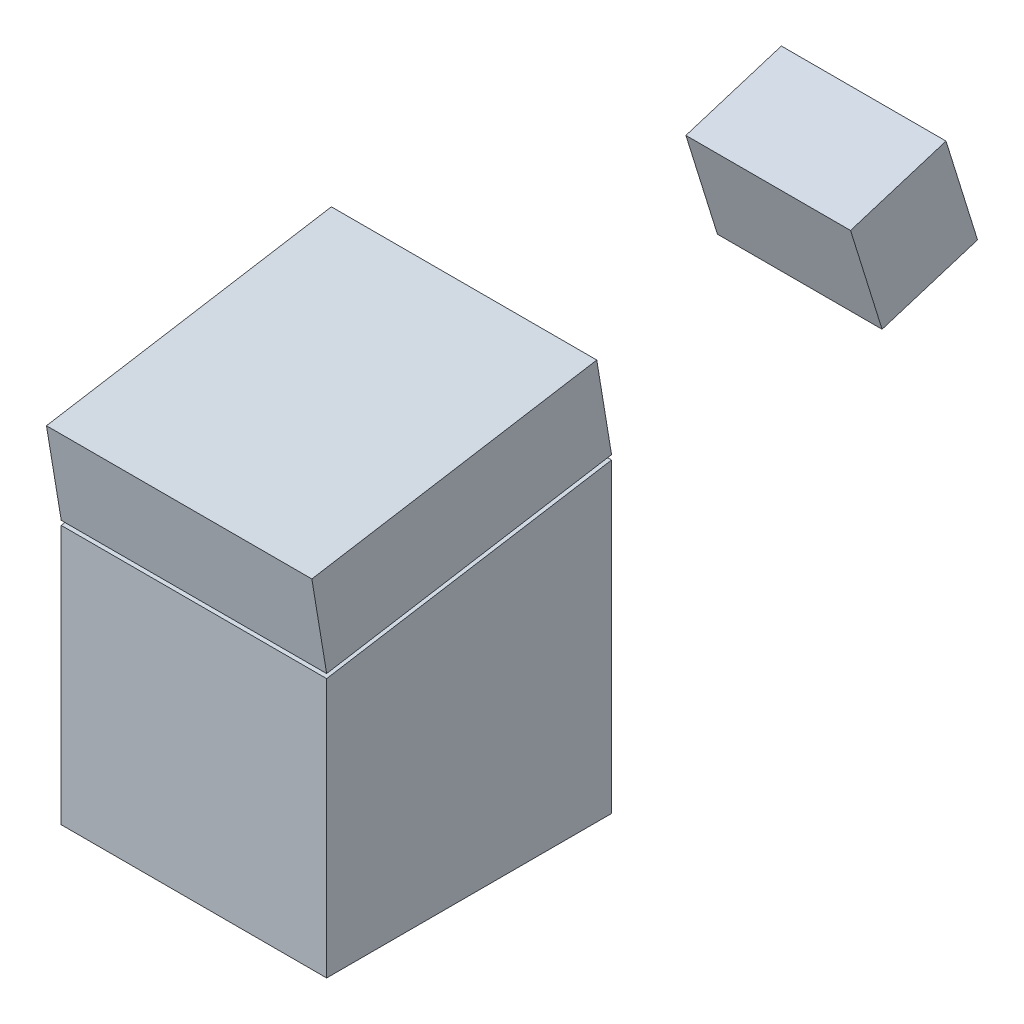
ISO-10303-21;
HEADER;
FILE_DESCRIPTION(('STEP AP214'),'2;1');
FILE_NAME('part.step','',(''),(''),'','','');
FILE_SCHEMA(('AUTOMOTIVE_DESIGN { 1 0 10303 214 1 1 1 1 }'));
ENDSEC;
DATA;
#1=APPLICATION_CONTEXT('core data for automotive mechanical design processes');
#2=APPLICATION_PROTOCOL_DEFINITION('international standard','automotive_design',2000,#1);
#3=PRODUCT_CONTEXT('',#1,'mechanical');
#4=PRODUCT('Part','Part','',(#3));
#5=PRODUCT_RELATED_PRODUCT_CATEGORY('part','',(#4));
#6=PRODUCT_DEFINITION_FORMATION('','',#4);
#7=PRODUCT_DEFINITION_CONTEXT('part definition',#1,'design');
#8=PRODUCT_DEFINITION('design','',#6,#7);
#9=PRODUCT_DEFINITION_SHAPE('','',#8);
#10=(LENGTH_UNIT() NAMED_UNIT(*) SI_UNIT(.MILLI.,.METRE.));
#11=(NAMED_UNIT(*) PLANE_ANGLE_UNIT() SI_UNIT($,.RADIAN.));
#12=(NAMED_UNIT(*) SI_UNIT($,.STERADIAN.) SOLID_ANGLE_UNIT());
#13=UNCERTAINTY_MEASURE_WITH_UNIT(LENGTH_MEASURE(1.E-05),#10,'distance_accuracy_value','');
#14=(GEOMETRIC_REPRESENTATION_CONTEXT(3) GLOBAL_UNCERTAINTY_ASSIGNED_CONTEXT((#13)) GLOBAL_UNIT_ASSIGNED_CONTEXT((#10,
#11,#12)) REPRESENTATION_CONTEXT('',''));
#15=CARTESIAN_POINT('',(0.,0.,0.));
#16=DIRECTION('',(0.,0.,1.));
#17=DIRECTION('',(1.,0.,0.));
#18=AXIS2_PLACEMENT_3D('',#15,#16,#17);
#19=CARTESIAN_POINT('',(-99.4303565591252,496.325864835687,685.54268727269));
#20=DIRECTION('',(0.,-0.297108830471233,0.9548436222));
#21=DIRECTION('',(0.,-0.9548436222,-0.297108830471233));
#22=AXIS2_PLACEMENT_3D('',#19,#20,#21);
#23=PLANE('',#22);
#24=DIRECTION('',(0.,-0.9548436222,-0.297108830471233));
#25=VECTOR('',#24,1.);
#26=CARTESIAN_POINT('',(99.4303565591252,496.325864835687,685.54268727269));
#27=LINE('',#26,#25);
#28=CARTESIAN_POINT('',(99.4303565591252,496.325864835687,685.54268727269));
#29=VERTEX_POINT('',#28);
#30=CARTESIAN_POINT('',(99.4303565591252,373.924864574069,647.456431899848));
#31=VERTEX_POINT('',#30);
#32=EDGE_CURVE('E114',#29,#31,#27,.T.);
#33=ORIENTED_EDGE('',*,*,#32,.F.);
#34=DIRECTION('',(1.,0.,0.));
#35=VECTOR('',#34,1.);
#36=CARTESIAN_POINT('',(-99.4303565591252,496.325864835687,685.54268727269));
#37=LINE('',#36,#35);
#38=CARTESIAN_POINT('',(-99.4303565591252,496.325864835687,685.54268727269));
#39=VERTEX_POINT('',#38);
#40=EDGE_CURVE('E12',#39,#29,#37,.T.);
#41=ORIENTED_EDGE('',*,*,#40,.F.);
#42=DIRECTION('',(0.,-0.9548436222,-0.297108830471233));
#43=VECTOR('',#42,1.);
#44=CARTESIAN_POINT('',(-99.4303565591252,496.325864835687,685.54268727269));
#45=LINE('',#44,#43);
#46=CARTESIAN_POINT('',(-99.4303565591252,373.924864574069,647.456431899848));
#47=VERTEX_POINT('',#46);
#48=EDGE_CURVE('E108',#39,#47,#45,.T.);
#49=ORIENTED_EDGE('',*,*,#48,.T.);
#50=DIRECTION('',(1.,0.,0.));
#51=VECTOR('',#50,1.);
#52=CARTESIAN_POINT('',(-99.4303565591252,373.924864574069,647.456431899848));
#53=LINE('',#52,#51);
#54=EDGE_CURVE('E53',#47,#31,#53,.T.);
#55=ORIENTED_EDGE('',*,*,#54,.T.);
#56=EDGE_LOOP('',(#33,#41,#49,#55));
#57=FACE_BOUND('',#56,.T.);
#58=ADVANCED_FACE('F50',(#57),#23,.T.);
#59=CARTESIAN_POINT('',(-99.4303565591252,532.198007420288,570.257367387619));
#60=DIRECTION('',(0.,0.9548436222,0.297108830471234));
#61=DIRECTION('',(0.,-0.297108830471234,0.9548436222));
#62=AXIS2_PLACEMENT_3D('',#59,#60,#61);
#63=PLANE('',#62);
#64=DIRECTION('',(0.,-0.297108830471234,0.9548436222));
#65=VECTOR('',#64,1.);
#66=CARTESIAN_POINT('',(99.4303565591252,532.198007420288,570.257367387619));
#67=LINE('',#66,#65);
#68=CARTESIAN_POINT('',(99.4303565591252,532.198007420288,570.257367387619));
#69=VERTEX_POINT('',#68);
#70=EDGE_CURVE('E110',#69,#29,#67,.T.);
#71=ORIENTED_EDGE('',*,*,#70,.F.);
#72=DIRECTION('',(1.,0.,0.));
#73=VECTOR('',#72,1.);
#74=CARTESIAN_POINT('',(-99.4303565591252,532.198007420288,570.257367387619));
#75=LINE('',#74,#73);
#76=CARTESIAN_POINT('',(-99.4303565591252,532.198007420288,570.257367387619));
#77=VERTEX_POINT('',#76);
#78=EDGE_CURVE('E59',#77,#69,#75,.T.);
#79=ORIENTED_EDGE('',*,*,#78,.F.);
#80=DIRECTION('',(0.,-0.297108830471234,0.9548436222));
#81=VECTOR('',#80,1.);
#82=CARTESIAN_POINT('',(-99.4303565591252,532.198007420288,570.257367387619));
#83=LINE('',#82,#81);
#84=EDGE_CURVE('E105',#77,#39,#83,.T.);
#85=ORIENTED_EDGE('',*,*,#84,.T.);
#86=ORIENTED_EDGE('',*,*,#40,.T.);
#87=EDGE_LOOP('',(#71,#79,#85,#86));
#88=FACE_BOUND('',#87,.T.);
#89=ADVANCED_FACE('F124',(#88),#63,.T.);
#90=CARTESIAN_POINT('',(-99.4303565591252,409.79700715867,532.171112014777));
#91=DIRECTION('',(0.,0.297108830471235,-0.954843622199999));
#92=DIRECTION('',(0.,0.954843622199999,0.297108830471235));
#93=AXIS2_PLACEMENT_3D('',#90,#91,#92);
#94=PLANE('',#93);
#95=DIRECTION('',(0.,0.954843622199999,0.297108830471235));
#96=VECTOR('',#95,1.);
#97=CARTESIAN_POINT('',(99.4303565591252,409.79700715867,532.171112014777));
#98=LINE('',#97,#96);
#99=CARTESIAN_POINT('',(99.4303565591252,409.79700715867,532.171112014777));
#100=VERTEX_POINT('',#99);
#101=EDGE_CURVE('E100',#100,#69,#98,.T.);
#102=ORIENTED_EDGE('',*,*,#101,.F.);
#103=DIRECTION('',(1.,0.,0.));
#104=VECTOR('',#103,1.);
#105=CARTESIAN_POINT('',(-99.4303565591252,409.79700715867,532.171112014777));
#106=LINE('',#105,#104);
#107=CARTESIAN_POINT('',(-99.4303565591252,409.79700715867,532.171112014777));
#108=VERTEX_POINT('',#107);
#109=EDGE_CURVE('E95',#108,#100,#106,.T.);
#110=ORIENTED_EDGE('',*,*,#109,.F.);
#111=DIRECTION('',(0.,0.954843622199999,0.297108830471235));
#112=VECTOR('',#111,1.);
#113=CARTESIAN_POINT('',(-99.4303565591252,409.79700715867,532.171112014777));
#114=LINE('',#113,#112);
#115=EDGE_CURVE('E98',#108,#77,#114,.T.);
#116=ORIENTED_EDGE('',*,*,#115,.T.);
#117=ORIENTED_EDGE('',*,*,#78,.T.);
#118=EDGE_LOOP('',(#102,#110,#116,#117));
#119=FACE_BOUND('',#118,.T.);
#120=ADVANCED_FACE('F97',(#119),#94,.T.);
#121=CARTESIAN_POINT('',(-99.4303565591252,373.924864574069,647.456431899848));
#122=DIRECTION('',(0.,-0.9548436222,-0.297108830471233));
#123=DIRECTION('',(0.,0.297108830471233,-0.9548436222));
#124=AXIS2_PLACEMENT_3D('',#121,#122,#123);
#125=PLANE('',#124);
#126=DIRECTION('',(0.,0.297108830471233,-0.9548436222));
#127=VECTOR('',#126,1.);
#128=CARTESIAN_POINT('',(99.4303565591252,373.924864574069,647.456431899848));
#129=LINE('',#128,#127);
#130=EDGE_CURVE('E117',#31,#100,#129,.T.);
#131=ORIENTED_EDGE('',*,*,#130,.F.);
#132=ORIENTED_EDGE('',*,*,#54,.F.);
#133=DIRECTION('',(0.,0.297108830471233,-0.9548436222));
#134=VECTOR('',#133,1.);
#135=CARTESIAN_POINT('',(-99.4303565591252,373.924864574069,647.456431899848));
#136=LINE('',#135,#134);
#137=EDGE_CURVE('E104',#47,#108,#136,.T.);
#138=ORIENTED_EDGE('',*,*,#137,.T.);
#139=ORIENTED_EDGE('',*,*,#109,.T.);
#140=EDGE_LOOP('',(#131,#132,#138,#139));
#141=FACE_BOUND('',#140,.T.);
#142=ADVANCED_FACE('F107',(#141),#125,.T.);
#143=CARTESIAN_POINT('',(-99.4303565591252,0.,0.));
#144=DIRECTION('',(1.,0.,0.));
#145=DIRECTION('',(0.,0.,-1.));
#146=AXIS2_PLACEMENT_3D('',#143,#144,#145);
#147=PLANE('',#146);
#148=ORIENTED_EDGE('',*,*,#48,.F.);
#149=ORIENTED_EDGE('',*,*,#84,.F.);
#150=ORIENTED_EDGE('',*,*,#115,.F.);
#151=ORIENTED_EDGE('',*,*,#137,.F.);
#152=EDGE_LOOP('',(#148,#149,#150,#151));
#153=FACE_BOUND('',#152,.T.);
#154=ADVANCED_FACE('F103',(#153),#147,.F.);
#155=CARTESIAN_POINT('',(99.4303565591252,0.,0.));
#156=DIRECTION('',(1.,0.,0.));
#157=DIRECTION('',(0.,0.,-1.));
#158=AXIS2_PLACEMENT_3D('',#155,#156,#157);
#159=PLANE('',#158);
#160=ORIENTED_EDGE('',*,*,#32,.T.);
#161=ORIENTED_EDGE('',*,*,#130,.T.);
#162=ORIENTED_EDGE('',*,*,#101,.T.);
#163=ORIENTED_EDGE('',*,*,#70,.T.);
#164=EDGE_LOOP('',(#160,#161,#162,#163));
#165=FACE_BOUND('',#164,.T.);
#166=ADVANCED_FACE('F123',(#165),#159,.T.);
#167=CLOSED_SHELL('',(#58,#89,#120,#142,#154,#166));
#168=MANIFOLD_SOLID_BREP('B2',#167);
#169=CARTESIAN_POINT('',(160.270085725645,517.980453358781,1397.00864886196));
#170=DIRECTION('',(0.,0.163226948434065,-0.986588548131846));
#171=DIRECTION('',(0.,0.986588548131846,0.163226948434065));
#172=AXIS2_PLACEMENT_3D('',#169,#170,#171);
#173=PLANE('',#172);
#174=DIRECTION('',(0.,-0.986588548131846,-0.163226948434065));
#175=VECTOR('',#174,1.);
#176=CARTESIAN_POINT('',(-160.270085725645,517.980453358781,1397.00864886196));
#177=LINE('',#176,#175);
#178=CARTESIAN_POINT('',(-160.270085725645,517.980453358781,1397.00864886196));
#179=VERTEX_POINT('',#178);
#180=CARTESIAN_POINT('',(-160.270085725645,410.056373940299,1379.15306136362));
#181=VERTEX_POINT('',#180);
#182=EDGE_CURVE('E246',#179,#181,#177,.T.);
#183=ORIENTED_EDGE('',*,*,#182,.T.);
#184=DIRECTION('',(-1.,0.,0.));
#185=VECTOR('',#184,1.);
#186=CARTESIAN_POINT('',(160.270085725645,410.056373940299,1379.15306136362));
#187=LINE('',#186,#185);
#188=CARTESIAN_POINT('',(160.270085725645,410.056373940299,1379.15306136362));
#189=VERTEX_POINT('',#188);
#190=EDGE_CURVE('E48',#189,#181,#187,.T.);
#191=ORIENTED_EDGE('',*,*,#190,.F.);
#192=DIRECTION('',(0.,-0.986588548131846,-0.163226948434065));
#193=VECTOR('',#192,1.);
#194=CARTESIAN_POINT('',(160.270085725645,517.980453358781,1397.00864886196));
#195=LINE('',#194,#193);
#196=CARTESIAN_POINT('',(160.270085725645,517.980453358781,1397.00864886196));
#197=VERTEX_POINT('',#196);
#198=EDGE_CURVE('E234',#197,#189,#195,.T.);
#199=ORIENTED_EDGE('',*,*,#198,.F.);
#200=DIRECTION('',(-1.,0.,0.));
#201=VECTOR('',#200,1.);
#202=CARTESIAN_POINT('',(160.270085725645,517.980453358781,1397.00864886196));
#203=LINE('',#202,#201);
#204=EDGE_CURVE('E242',#197,#179,#203,.T.);
#205=ORIENTED_EDGE('',*,*,#204,.T.);
#206=EDGE_LOOP('',(#183,#191,#199,#205));
#207=FACE_BOUND('',#206,.T.);
#208=ADVANCED_FACE('F183',(#207),#173,.F.);
#209=CARTESIAN_POINT('',(160.270085725645,410.056373940299,1379.15306136362));
#210=DIRECTION('',(0.,0.986588548131846,0.163226948434065));
#211=DIRECTION('',(0.,-0.163226948434065,0.986588548131845));
#212=AXIS2_PLACEMENT_3D('',#209,#210,#211);
#213=PLANE('',#212);
#214=DIRECTION('',(0.,0.163226948434065,-0.986588548131846));
#215=VECTOR('',#214,1.);
#216=CARTESIAN_POINT('',(-160.270085725645,410.056373940299,1379.15306136362));
#217=LINE('',#216,#215);
#218=CARTESIAN_POINT('',(-160.270085725645,466.987725211271,1035.04432360638));
#219=VERTEX_POINT('',#218);
#220=EDGE_CURVE('E238',#181,#219,#217,.T.);
#221=ORIENTED_EDGE('',*,*,#220,.T.);
#222=DIRECTION('',(-1.,0.,0.));
#223=VECTOR('',#222,1.);
#224=CARTESIAN_POINT('',(160.270085725645,466.987725211271,1035.04432360638));
#225=LINE('',#224,#223);
#226=CARTESIAN_POINT('',(160.270085725645,466.987725211271,1035.04432360638));
#227=VERTEX_POINT('',#226);
#228=EDGE_CURVE('E191',#227,#219,#225,.T.);
#229=ORIENTED_EDGE('',*,*,#228,.F.);
#230=DIRECTION('',(0.,0.163226948434065,-0.986588548131846));
#231=VECTOR('',#230,1.);
#232=CARTESIAN_POINT('',(160.270085725645,410.056373940299,1379.15306136362));
#233=LINE('',#232,#231);
#234=EDGE_CURVE('E229',#189,#227,#233,.T.);
#235=ORIENTED_EDGE('',*,*,#234,.F.);
#236=ORIENTED_EDGE('',*,*,#190,.T.);
#237=EDGE_LOOP('',(#221,#229,#235,#236));
#238=FACE_BOUND('',#237,.T.);
#239=ADVANCED_FACE('F237',(#238),#213,.F.);
#240=CARTESIAN_POINT('',(160.270085725645,466.987725211271,1035.04432360638));
#241=DIRECTION('',(0.,-0.163226948434065,0.986588548131846));
#242=DIRECTION('',(0.,-0.986588548131846,-0.163226948434065));
#243=AXIS2_PLACEMENT_3D('',#240,#241,#242);
#244=PLANE('',#243);
#245=DIRECTION('',(0.,0.986588548131845,0.163226948434065));
#246=VECTOR('',#245,1.);
#247=CARTESIAN_POINT('',(-160.270085725645,466.987725211271,1035.04432360638));
#248=LINE('',#247,#246);
#249=CARTESIAN_POINT('',(-160.270085725645,574.911804629753,1052.89991110472));
#250=VERTEX_POINT('',#249);
#251=EDGE_CURVE('E216',#219,#250,#248,.T.);
#252=ORIENTED_EDGE('',*,*,#251,.T.);
#253=DIRECTION('',(-1.,0.,0.));
#254=VECTOR('',#253,1.);
#255=CARTESIAN_POINT('',(160.270085725645,574.911804629753,1052.89991110472));
#256=LINE('',#255,#254);
#257=CARTESIAN_POINT('',(160.270085725645,574.911804629753,1052.89991110472));
#258=VERTEX_POINT('',#257);
#259=EDGE_CURVE('E239',#258,#250,#256,.T.);
#260=ORIENTED_EDGE('',*,*,#259,.F.);
#261=DIRECTION('',(0.,0.986588548131845,0.163226948434065));
#262=VECTOR('',#261,1.);
#263=CARTESIAN_POINT('',(160.270085725645,466.987725211271,1035.04432360638));
#264=LINE('',#263,#262);
#265=EDGE_CURVE('E232',#227,#258,#264,.T.);
#266=ORIENTED_EDGE('',*,*,#265,.F.);
#267=ORIENTED_EDGE('',*,*,#228,.T.);
#268=EDGE_LOOP('',(#252,#260,#266,#267));
#269=FACE_BOUND('',#268,.T.);
#270=ADVANCED_FACE('F240',(#269),#244,.F.);
#271=CARTESIAN_POINT('',(160.270085725645,574.911804629753,1052.89991110472));
#272=DIRECTION('',(0.,-0.986588548131846,-0.163226948434065));
#273=DIRECTION('',(0.,0.163226948434065,-0.986588548131846));
#274=AXIS2_PLACEMENT_3D('',#271,#272,#273);
#275=PLANE('',#274);
#276=DIRECTION('',(0.,-0.163226948434065,0.986588548131846));
#277=VECTOR('',#276,1.);
#278=CARTESIAN_POINT('',(-160.270085725645,574.911804629753,1052.89991110472));
#279=LINE('',#278,#277);
#280=EDGE_CURVE('E222',#250,#179,#279,.T.);
#281=ORIENTED_EDGE('',*,*,#280,.T.);
#282=ORIENTED_EDGE('',*,*,#204,.F.);
#283=DIRECTION('',(0.,-0.163226948434065,0.986588548131846));
#284=VECTOR('',#283,1.);
#285=CARTESIAN_POINT('',(160.270085725645,574.911804629753,1052.89991110472));
#286=LINE('',#285,#284);
#287=EDGE_CURVE('E199',#258,#197,#286,.T.);
#288=ORIENTED_EDGE('',*,*,#287,.F.);
#289=ORIENTED_EDGE('',*,*,#259,.T.);
#290=EDGE_LOOP('',(#281,#282,#288,#289));
#291=FACE_BOUND('',#290,.T.);
#292=ADVANCED_FACE('F253',(#291),#275,.F.);
#293=CARTESIAN_POINT('',(160.270085725645,0.,0.));
#294=DIRECTION('',(1.,0.,0.));
#295=DIRECTION('',(0.,0.,-1.));
#296=AXIS2_PLACEMENT_3D('',#293,#294,#295);
#297=PLANE('',#296);
#298=ORIENTED_EDGE('',*,*,#198,.T.);
#299=ORIENTED_EDGE('',*,*,#234,.T.);
#300=ORIENTED_EDGE('',*,*,#265,.T.);
#301=ORIENTED_EDGE('',*,*,#287,.T.);
#302=EDGE_LOOP('',(#298,#299,#300,#301));
#303=FACE_BOUND('',#302,.T.);
#304=ADVANCED_FACE('F230',(#303),#297,.T.);
#305=CARTESIAN_POINT('',(-160.270085725645,0.,0.));
#306=DIRECTION('',(1.,0.,0.));
#307=DIRECTION('',(0.,0.,-1.));
#308=AXIS2_PLACEMENT_3D('',#305,#306,#307);
#309=PLANE('',#308);
#310=ORIENTED_EDGE('',*,*,#182,.F.);
#311=ORIENTED_EDGE('',*,*,#280,.F.);
#312=ORIENTED_EDGE('',*,*,#251,.F.);
#313=ORIENTED_EDGE('',*,*,#220,.F.);
#314=EDGE_LOOP('',(#310,#311,#312,#313));
#315=FACE_BOUND('',#314,.T.);
#316=ADVANCED_FACE('F256',(#315),#309,.F.);
#317=CLOSED_SHELL('',(#208,#239,#270,#292,#304,#316));
#318=MANIFOLD_SOLID_BREP('B6',#317);
#319=CARTESIAN_POINT('',(160.270085725645,91.6546849573422,1035.04432360638));
#320=DIRECTION('',(0.,0.,1.));
#321=DIRECTION('',(1.,0.,0.));
#322=AXIS2_PLACEMENT_3D('',#319,#320,#321);
#323=PLANE('',#322);
#324=DIRECTION('',(0.,1.,0.));
#325=VECTOR('',#324,1.);
#326=CARTESIAN_POINT('',(-160.270085725645,91.6546849573422,1035.04432360638));
#327=LINE('',#326,#325);
#328=CARTESIAN_POINT('',(-160.270085725645,91.6546849573422,1035.04432360638));
#329=VERTEX_POINT('',#328);
#330=CARTESIAN_POINT('',(-160.270085725645,461.4167733443,1035.04432360638));
#331=VERTEX_POINT('',#330);
#332=EDGE_CURVE('E370',#329,#331,#327,.T.);
#333=ORIENTED_EDGE('',*,*,#332,.T.);
#334=DIRECTION('',(-1.,0.,0.));
#335=VECTOR('',#334,1.);
#336=CARTESIAN_POINT('',(160.270085725645,461.4167733443,1035.04432360638));
#337=LINE('',#336,#335);
#338=CARTESIAN_POINT('',(160.270085725645,461.4167733443,1035.04432360638));
#339=VERTEX_POINT('',#338);
#340=EDGE_CURVE('E181',#339,#331,#337,.T.);
#341=ORIENTED_EDGE('',*,*,#340,.F.);
#342=DIRECTION('',(0.,1.,0.));
#343=VECTOR('',#342,1.);
#344=CARTESIAN_POINT('',(160.270085725645,91.6546849573422,1035.04432360638));
#345=LINE('',#344,#343);
#346=CARTESIAN_POINT('',(160.270085725645,91.6546849573422,1035.04432360638));
#347=VERTEX_POINT('',#346);
#348=EDGE_CURVE('E358',#347,#339,#345,.T.);
#349=ORIENTED_EDGE('',*,*,#348,.F.);
#350=DIRECTION('',(-1.,0.,0.));
#351=VECTOR('',#350,1.);
#352=CARTESIAN_POINT('',(160.270085725645,91.6546849573422,1035.04432360638));
#353=LINE('',#352,#351);
#354=EDGE_CURVE('E366',#347,#329,#353,.T.);
#355=ORIENTED_EDGE('',*,*,#354,.T.);
#356=EDGE_LOOP('',(#333,#341,#349,#355));
#357=FACE_BOUND('',#356,.T.);
#358=ADVANCED_FACE('F307',(#357),#323,.F.);
#359=CARTESIAN_POINT('',(160.270085725645,461.4167733443,1035.04432360638));
#360=DIRECTION('',(0.,-0.986734562453215,-0.162341933154256));
#361=DIRECTION('',(0.,0.162341933154257,-0.986734562453216));
#362=AXIS2_PLACEMENT_3D('',#359,#360,#361);
#363=PLANE('',#362);
#364=DIRECTION('',(0.,-0.162341933154257,0.986734562453216));
#365=VECTOR('',#364,1.);
#366=CARTESIAN_POINT('',(-160.270085725645,461.4167733443,1035.04432360638));
#367=LINE('',#366,#365);
#368=CARTESIAN_POINT('',(-160.270085725645,404.802482299407,1379.15306136362));
#369=VERTEX_POINT('',#368);
#370=EDGE_CURVE('E362',#331,#369,#367,.T.);
#371=ORIENTED_EDGE('',*,*,#370,.T.);
#372=DIRECTION('',(-1.,0.,0.));
#373=VECTOR('',#372,1.);
#374=CARTESIAN_POINT('',(160.270085725645,404.802482299407,1379.15306136362));
#375=LINE('',#374,#373);
#376=CARTESIAN_POINT('',(160.270085725645,404.802482299407,1379.15306136362));
#377=VERTEX_POINT('',#376);
#378=EDGE_CURVE('E315',#377,#369,#375,.T.);
#379=ORIENTED_EDGE('',*,*,#378,.F.);
#380=DIRECTION('',(0.,-0.162341933154257,0.986734562453216));
#381=VECTOR('',#380,1.);
#382=CARTESIAN_POINT('',(160.270085725645,461.4167733443,1035.04432360638));
#383=LINE('',#382,#381);
#384=EDGE_CURVE('E353',#339,#377,#383,.T.);
#385=ORIENTED_EDGE('',*,*,#384,.F.);
#386=ORIENTED_EDGE('',*,*,#340,.T.);
#387=EDGE_LOOP('',(#371,#379,#385,#386));
#388=FACE_BOUND('',#387,.T.);
#389=ADVANCED_FACE('F361',(#388),#363,.F.);
#390=CARTESIAN_POINT('',(160.270085725645,404.802482299407,1379.15306136362));
#391=DIRECTION('',(0.,0.,-1.));
#392=DIRECTION('',(-1.,0.,0.));
#393=AXIS2_PLACEMENT_3D('',#390,#391,#392);
#394=PLANE('',#393);
#395=DIRECTION('',(0.,-1.,0.));
#396=VECTOR('',#395,1.);
#397=CARTESIAN_POINT('',(-160.270085725645,404.802482299407,1379.15306136362));
#398=LINE('',#397,#396);
#399=CARTESIAN_POINT('',(-160.270085725645,91.6546849573422,1379.15306136362));
#400=VERTEX_POINT('',#399);
#401=EDGE_CURVE('E340',#369,#400,#398,.T.);
#402=ORIENTED_EDGE('',*,*,#401,.T.);
#403=DIRECTION('',(-1.,0.,0.));
#404=VECTOR('',#403,1.);
#405=CARTESIAN_POINT('',(160.270085725645,91.6546849573422,1379.15306136362));
#406=LINE('',#405,#404);
#407=CARTESIAN_POINT('',(160.270085725645,91.6546849573422,1379.15306136362));
#408=VERTEX_POINT('',#407);
#409=EDGE_CURVE('E363',#408,#400,#406,.T.);
#410=ORIENTED_EDGE('',*,*,#409,.F.);
#411=DIRECTION('',(0.,-1.,0.));
#412=VECTOR('',#411,1.);
#413=CARTESIAN_POINT('',(160.270085725645,404.802482299407,1379.15306136362));
#414=LINE('',#413,#412);
#415=EDGE_CURVE('E356',#377,#408,#414,.T.);
#416=ORIENTED_EDGE('',*,*,#415,.F.);
#417=ORIENTED_EDGE('',*,*,#378,.T.);
#418=EDGE_LOOP('',(#402,#410,#416,#417));
#419=FACE_BOUND('',#418,.T.);
#420=ADVANCED_FACE('F364',(#419),#394,.F.);
#421=CARTESIAN_POINT('',(160.270085725645,91.6546849573422,1379.15306136362));
#422=DIRECTION('',(0.,1.,0.));
#423=DIRECTION('',(0.,0.,1.));
#424=AXIS2_PLACEMENT_3D('',#421,#422,#423);
#425=PLANE('',#424);
#426=DIRECTION('',(0.,0.,-1.));
#427=VECTOR('',#426,1.);
#428=CARTESIAN_POINT('',(-160.270085725645,91.6546849573422,1379.15306136362));
#429=LINE('',#428,#427);
#430=EDGE_CURVE('E346',#400,#329,#429,.T.);
#431=ORIENTED_EDGE('',*,*,#430,.T.);
#432=ORIENTED_EDGE('',*,*,#354,.F.);
#433=DIRECTION('',(0.,0.,-1.));
#434=VECTOR('',#433,1.);
#435=CARTESIAN_POINT('',(160.270085725645,91.6546849573422,1379.15306136362));
#436=LINE('',#435,#434);
#437=EDGE_CURVE('E323',#408,#347,#436,.T.);
#438=ORIENTED_EDGE('',*,*,#437,.F.);
#439=ORIENTED_EDGE('',*,*,#409,.T.);
#440=EDGE_LOOP('',(#431,#432,#438,#439));
#441=FACE_BOUND('',#440,.T.);
#442=ADVANCED_FACE('F377',(#441),#425,.F.);
#443=CARTESIAN_POINT('',(160.270085725645,0.,0.));
#444=DIRECTION('',(-1.,0.,0.));
#445=DIRECTION('',(0.,0.,1.));
#446=AXIS2_PLACEMENT_3D('',#443,#444,#445);
#447=PLANE('',#446);
#448=ORIENTED_EDGE('',*,*,#348,.T.);
#449=ORIENTED_EDGE('',*,*,#384,.T.);
#450=ORIENTED_EDGE('',*,*,#415,.T.);
#451=ORIENTED_EDGE('',*,*,#437,.T.);
#452=EDGE_LOOP('',(#448,#449,#450,#451));
#453=FACE_BOUND('',#452,.T.);
#454=ADVANCED_FACE('F354',(#453),#447,.F.);
#455=CARTESIAN_POINT('',(-160.270085725645,0.,0.));
#456=DIRECTION('',(-1.,0.,0.));
#457=DIRECTION('',(0.,0.,1.));
#458=AXIS2_PLACEMENT_3D('',#455,#456,#457);
#459=PLANE('',#458);
#460=ORIENTED_EDGE('',*,*,#332,.F.);
#461=ORIENTED_EDGE('',*,*,#430,.F.);
#462=ORIENTED_EDGE('',*,*,#401,.F.);
#463=ORIENTED_EDGE('',*,*,#370,.F.);
#464=EDGE_LOOP('',(#460,#461,#462,#463));
#465=FACE_BOUND('',#464,.T.);
#466=ADVANCED_FACE('F380',(#465),#459,.T.);
#467=CLOSED_SHELL('',(#358,#389,#420,#442,#454,#466));
#468=MANIFOLD_SOLID_BREP('B42',#467);
#469=ADVANCED_BREP_SHAPE_REPRESENTATION('',(#18,#168,#318,#468),#14);
#470=SHAPE_DEFINITION_REPRESENTATION(#9,#469);
ENDSEC;
END-ISO-10303-21;
